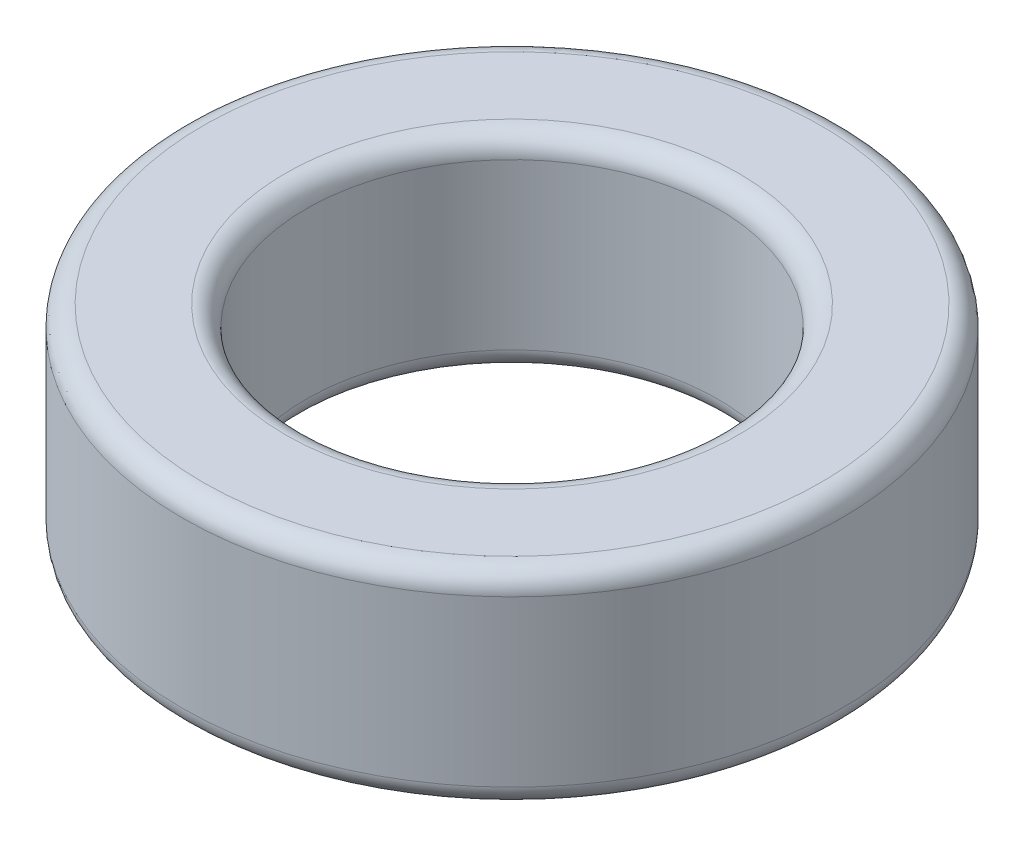
ISO-10303-21;
HEADER;
FILE_DESCRIPTION(('STEP AP214'),'2;1');
FILE_NAME('part.step','',(''),(''),'','','');
FILE_SCHEMA(('AUTOMOTIVE_DESIGN { 1 0 10303 214 1 1 1 1 }'));
ENDSEC;
DATA;
#1=APPLICATION_CONTEXT('core data for automotive mechanical design processes');
#2=APPLICATION_PROTOCOL_DEFINITION('international standard','automotive_design',2000,#1);
#3=PRODUCT_CONTEXT('',#1,'mechanical');
#4=PRODUCT('Part','Part','',(#3));
#5=PRODUCT_RELATED_PRODUCT_CATEGORY('part','',(#4));
#6=PRODUCT_DEFINITION_FORMATION('','',#4);
#7=PRODUCT_DEFINITION_CONTEXT('part definition',#1,'design');
#8=PRODUCT_DEFINITION('design','',#6,#7);
#9=PRODUCT_DEFINITION_SHAPE('','',#8);
#10=(LENGTH_UNIT() NAMED_UNIT(*) SI_UNIT(.MILLI.,.METRE.));
#11=(NAMED_UNIT(*) PLANE_ANGLE_UNIT() SI_UNIT($,.RADIAN.));
#12=(NAMED_UNIT(*) SI_UNIT($,.STERADIAN.) SOLID_ANGLE_UNIT());
#13=UNCERTAINTY_MEASURE_WITH_UNIT(LENGTH_MEASURE(1.E-05),#10,'distance_accuracy_value','');
#14=(GEOMETRIC_REPRESENTATION_CONTEXT(3) GLOBAL_UNCERTAINTY_ASSIGNED_CONTEXT((#13)) GLOBAL_UNIT_ASSIGNED_CONTEXT((#10,
#11,#12)) REPRESENTATION_CONTEXT('',''));
#15=CARTESIAN_POINT('',(0.,0.,0.));
#16=DIRECTION('',(0.,0.,1.));
#17=DIRECTION('',(1.,0.,0.));
#18=AXIS2_PLACEMENT_3D('',#15,#16,#17);
#19=CARTESIAN_POINT('',(0.,5.,0.));
#20=DIRECTION('',(0.,1.,0.));
#21=DIRECTION('',(0.,0.,1.));
#22=AXIS2_PLACEMENT_3D('',#19,#20,#21);
#23=PLANE('',#22);
#24=CARTESIAN_POINT('',(0.,5.,0.));
#25=DIRECTION('',(0.,1.,0.));
#26=DIRECTION('',(0.,0.,1.));
#27=AXIS2_PLACEMENT_3D('',#24,#25,#26);
#28=CIRCLE('',#27,5.5);
#29=CARTESIAN_POINT('',(0.,5.,5.5));
#30=VERTEX_POINT('',#29);
#31=EDGE_CURVE('E10',#30,#30,#28,.F.);
#32=ORIENTED_EDGE('',*,*,#31,.T.);
#33=EDGE_LOOP('',(#32));
#34=FACE_BOUND('',#33,.T.);
#35=CARTESIAN_POINT('',(0.,5.,0.));
#36=DIRECTION('',(0.,1.,0.));
#37=DIRECTION('',(0.,0.,1.));
#38=AXIS2_PLACEMENT_3D('',#35,#36,#37);
#39=CIRCLE('',#38,7.5);
#40=CARTESIAN_POINT('',(0.,5.,7.5));
#41=VERTEX_POINT('',#40);
#42=EDGE_CURVE('E41',#41,#41,#39,.T.);
#43=ORIENTED_EDGE('',*,*,#42,.T.);
#44=EDGE_LOOP('',(#43));
#45=FACE_BOUND('',#44,.T.);
#46=ADVANCED_FACE('F34',(#34,#45),#23,.T.);
#47=CARTESIAN_POINT('',(0.,0.,0.));
#48=DIRECTION('',(0.,1.,0.));
#49=DIRECTION('',(0.,0.,1.));
#50=AXIS2_PLACEMENT_3D('',#47,#48,#49);
#51=PLANE('',#50);
#52=CARTESIAN_POINT('',(0.,0.,0.));
#53=DIRECTION('',(0.,1.,0.));
#54=DIRECTION('',(0.,0.,1.));
#55=AXIS2_PLACEMENT_3D('',#52,#53,#54);
#56=CIRCLE('',#55,7.5);
#57=CARTESIAN_POINT('',(0.,0.,7.5));
#58=VERTEX_POINT('',#57);
#59=EDGE_CURVE('E54',#58,#58,#56,.F.);
#60=ORIENTED_EDGE('',*,*,#59,.T.);
#61=EDGE_LOOP('',(#60));
#62=FACE_BOUND('',#61,.T.);
#63=CARTESIAN_POINT('',(0.,0.,0.));
#64=DIRECTION('',(0.,1.,0.));
#65=DIRECTION('',(0.,0.,1.));
#66=AXIS2_PLACEMENT_3D('',#63,#64,#65);
#67=CIRCLE('',#66,5.5);
#68=CARTESIAN_POINT('',(0.,0.,5.5));
#69=VERTEX_POINT('',#68);
#70=EDGE_CURVE('E57',#69,#69,#67,.T.);
#71=ORIENTED_EDGE('',*,*,#70,.T.);
#72=EDGE_LOOP('',(#71));
#73=FACE_BOUND('',#72,.T.);
#74=ADVANCED_FACE('F78',(#62,#73),#51,.F.);
#75=CARTESIAN_POINT('',(0.,5.,0.));
#76=DIRECTION('',(0.,-1.,0.));
#77=DIRECTION('',(0.,0.,-1.));
#78=AXIS2_PLACEMENT_3D('',#75,#76,#77);
#79=CYLINDRICAL_SURFACE('',#78,8.);
#80=CARTESIAN_POINT('',(0.,0.5,0.));
#81=DIRECTION('',(0.,1.,0.));
#82=DIRECTION('',(0.,0.,1.));
#83=AXIS2_PLACEMENT_3D('',#80,#81,#82);
#84=CIRCLE('',#83,8.);
#85=CARTESIAN_POINT('',(0.,0.5,8.));
#86=VERTEX_POINT('',#85);
#87=EDGE_CURVE('E60',#86,#86,#84,.T.);
#88=ORIENTED_EDGE('',*,*,#87,.T.);
#89=EDGE_LOOP('',(#88));
#90=FACE_BOUND('',#89,.T.);
#91=CARTESIAN_POINT('',(0.,4.5,0.));
#92=DIRECTION('',(0.,1.,0.));
#93=DIRECTION('',(0.,0.,1.));
#94=AXIS2_PLACEMENT_3D('',#91,#92,#93);
#95=CIRCLE('',#94,8.);
#96=CARTESIAN_POINT('',(0.,4.5,8.));
#97=VERTEX_POINT('',#96);
#98=EDGE_CURVE('E63',#97,#97,#95,.F.);
#99=ORIENTED_EDGE('',*,*,#98,.T.);
#100=EDGE_LOOP('',(#99));
#101=FACE_BOUND('',#100,.T.);
#102=ADVANCED_FACE('F67',(#90,#101),#79,.T.);
#103=CARTESIAN_POINT('',(0.,5.,0.));
#104=DIRECTION('',(0.,-1.,0.));
#105=DIRECTION('',(0.,0.,-1.));
#106=AXIS2_PLACEMENT_3D('',#103,#104,#105);
#107=CYLINDRICAL_SURFACE('',#106,5.);
#108=CARTESIAN_POINT('',(0.,0.5,0.));
#109=DIRECTION('',(0.,1.,0.));
#110=DIRECTION('',(0.,0.,1.));
#111=AXIS2_PLACEMENT_3D('',#108,#109,#110);
#112=CIRCLE('',#111,5.);
#113=CARTESIAN_POINT('',(0.,0.5,5.));
#114=VERTEX_POINT('',#113);
#115=EDGE_CURVE('E45',#114,#114,#112,.F.);
#116=ORIENTED_EDGE('',*,*,#115,.T.);
#117=EDGE_LOOP('',(#116));
#118=FACE_BOUND('',#117,.T.);
#119=CARTESIAN_POINT('',(0.,4.5,0.));
#120=DIRECTION('',(0.,1.,0.));
#121=DIRECTION('',(0.,0.,1.));
#122=AXIS2_PLACEMENT_3D('',#119,#120,#121);
#123=CIRCLE('',#122,5.);
#124=CARTESIAN_POINT('',(0.,4.5,5.));
#125=VERTEX_POINT('',#124);
#126=EDGE_CURVE('E49',#125,#125,#123,.T.);
#127=ORIENTED_EDGE('',*,*,#126,.T.);
#128=EDGE_LOOP('',(#127));
#129=FACE_BOUND('',#128,.T.);
#130=ADVANCED_FACE('F86',(#118,#129),#107,.F.);
#131=CARTESIAN_POINT('',(0.,0.5,0.));
#132=DIRECTION('',(0.,1.,0.));
#133=DIRECTION('',(0.,0.,1.));
#134=AXIS2_PLACEMENT_3D('',#131,#132,#133);
#135=TOROIDAL_SURFACE('',#134,7.5,0.5);
#136=ORIENTED_EDGE('',*,*,#59,.F.);
#137=EDGE_LOOP('',(#136));
#138=FACE_BOUND('',#137,.T.);
#139=ORIENTED_EDGE('',*,*,#87,.F.);
#140=EDGE_LOOP('',(#139));
#141=FACE_BOUND('',#140,.T.);
#142=ADVANCED_FACE('F91',(#138,#141),#135,.T.);
#143=CARTESIAN_POINT('',(0.,0.5,0.));
#144=DIRECTION('',(0.,1.,0.));
#145=DIRECTION('',(0.,0.,1.));
#146=AXIS2_PLACEMENT_3D('',#143,#144,#145);
#147=TOROIDAL_SURFACE('',#146,5.5,0.5);
#148=ORIENTED_EDGE('',*,*,#115,.F.);
#149=EDGE_LOOP('',(#148));
#150=FACE_BOUND('',#149,.T.);
#151=ORIENTED_EDGE('',*,*,#70,.F.);
#152=EDGE_LOOP('',(#151));
#153=FACE_BOUND('',#152,.T.);
#154=ADVANCED_FACE('F75',(#150,#153),#147,.T.);
#155=CARTESIAN_POINT('',(0.,4.5,0.));
#156=DIRECTION('',(0.,1.,0.));
#157=DIRECTION('',(0.,0.,1.));
#158=AXIS2_PLACEMENT_3D('',#155,#156,#157);
#159=TOROIDAL_SURFACE('',#158,5.5,0.5);
#160=ORIENTED_EDGE('',*,*,#31,.F.);
#161=EDGE_LOOP('',(#160));
#162=FACE_BOUND('',#161,.T.);
#163=ORIENTED_EDGE('',*,*,#126,.F.);
#164=EDGE_LOOP('',(#163));
#165=FACE_BOUND('',#164,.T.);
#166=ADVANCED_FACE('F71',(#162,#165),#159,.T.);
#167=CARTESIAN_POINT('',(0.,4.5,0.));
#168=DIRECTION('',(0.,1.,0.));
#169=DIRECTION('',(0.,0.,1.));
#170=AXIS2_PLACEMENT_3D('',#167,#168,#169);
#171=TOROIDAL_SURFACE('',#170,7.5,0.5);
#172=ORIENTED_EDGE('',*,*,#98,.F.);
#173=EDGE_LOOP('',(#172));
#174=FACE_BOUND('',#173,.T.);
#175=ORIENTED_EDGE('',*,*,#42,.F.);
#176=EDGE_LOOP('',(#175));
#177=FACE_BOUND('',#176,.T.);
#178=ADVANCED_FACE('F36',(#174,#177),#171,.T.);
#179=CLOSED_SHELL('',(#46,#74,#102,#130,#142,#154,#166,#178));
#180=MANIFOLD_SOLID_BREP('B2',#179);
#181=ADVANCED_BREP_SHAPE_REPRESENTATION('',(#18,#180),#14);
#182=SHAPE_DEFINITION_REPRESENTATION(#9,#181);
ENDSEC;
END-ISO-10303-21;
